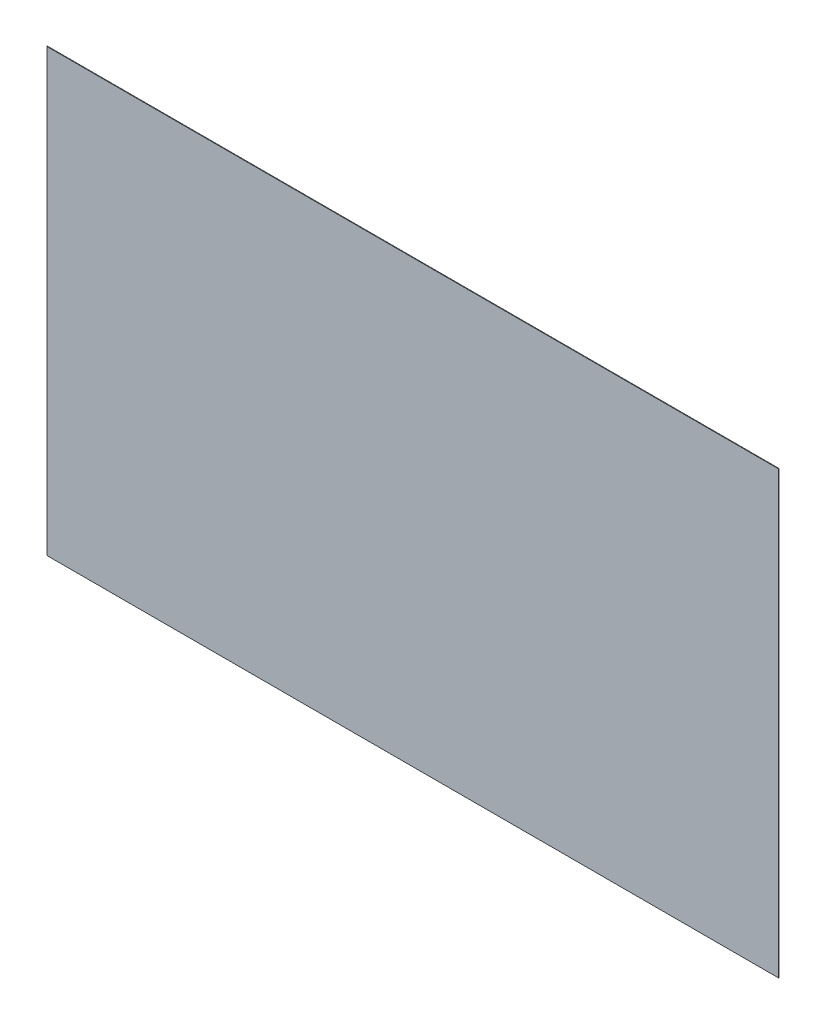
ISO-10303-21;
HEADER;
FILE_DESCRIPTION(('STEP AP214'),'2;1');
FILE_NAME('part.step','',(''),(''),'','','');
FILE_SCHEMA(('AUTOMOTIVE_DESIGN { 1 0 10303 214 1 1 1 1 }'));
ENDSEC;
DATA;
#1=APPLICATION_CONTEXT('core data for automotive mechanical design processes');
#2=APPLICATION_PROTOCOL_DEFINITION('international standard','automotive_design',2000,#1);
#3=PRODUCT_CONTEXT('',#1,'mechanical');
#4=PRODUCT('Part','Part','',(#3));
#5=PRODUCT_RELATED_PRODUCT_CATEGORY('part','',(#4));
#6=PRODUCT_DEFINITION_FORMATION('','',#4);
#7=PRODUCT_DEFINITION_CONTEXT('part definition',#1,'design');
#8=PRODUCT_DEFINITION('design','',#6,#7);
#9=PRODUCT_DEFINITION_SHAPE('','',#8);
#10=(LENGTH_UNIT() NAMED_UNIT(*) SI_UNIT(.MILLI.,.METRE.));
#11=(NAMED_UNIT(*) PLANE_ANGLE_UNIT() SI_UNIT($,.RADIAN.));
#12=(NAMED_UNIT(*) SI_UNIT($,.STERADIAN.) SOLID_ANGLE_UNIT());
#13=UNCERTAINTY_MEASURE_WITH_UNIT(LENGTH_MEASURE(1.E-05),#10,'distance_accuracy_value','');
#14=(GEOMETRIC_REPRESENTATION_CONTEXT(3) GLOBAL_UNCERTAINTY_ASSIGNED_CONTEXT((#13)) GLOBAL_UNIT_ASSIGNED_CONTEXT((#10,
#11,#12)) REPRESENTATION_CONTEXT('',''));
#15=CARTESIAN_POINT('',(0.,0.,0.));
#16=DIRECTION('',(0.,0.,1.));
#17=DIRECTION('',(1.,0.,0.));
#18=AXIS2_PLACEMENT_3D('',#15,#16,#17);
#19=CARTESIAN_POINT('',(2500.,1506.,2.));
#20=DIRECTION('',(0.,-1.,0.));
#21=DIRECTION('',(1.,0.,0.));
#22=AXIS2_PLACEMENT_3D('',#19,#20,#21);
#23=PLANE('',#22);
#24=DIRECTION('',(-1.,0.,0.));
#25=VECTOR('',#24,1.);
#26=CARTESIAN_POINT('',(2500.,1506.,0.));
#27=LINE('',#26,#25);
#28=CARTESIAN_POINT('',(2500.,1506.,0.));
#29=VERTEX_POINT('',#28);
#30=CARTESIAN_POINT('',(-1.70348369761397E-13,1506.,0.));
#31=VERTEX_POINT('',#30);
#32=EDGE_CURVE('E107',#29,#31,#27,.T.);
#33=ORIENTED_EDGE('',*,*,#32,.T.);
#34=DIRECTION('',(0.,0.,-1.));
#35=VECTOR('',#34,1.);
#36=CARTESIAN_POINT('',(-1.70348369761397E-13,1506.,2.));
#37=LINE('',#36,#35);
#38=CARTESIAN_POINT('',(-1.70348369761397E-13,1506.,2.));
#39=VERTEX_POINT('',#38);
#40=EDGE_CURVE('E11',#39,#31,#37,.T.);
#41=ORIENTED_EDGE('',*,*,#40,.F.);
#42=DIRECTION('',(-1.,0.,0.));
#43=VECTOR('',#42,1.);
#44=CARTESIAN_POINT('',(2500.,1506.,2.));
#45=LINE('',#44,#43);
#46=CARTESIAN_POINT('',(2500.,1506.,2.));
#47=VERTEX_POINT('',#46);
#48=EDGE_CURVE('E91',#47,#39,#45,.T.);
#49=ORIENTED_EDGE('',*,*,#48,.F.);
#50=DIRECTION('',(0.,0.,-1.));
#51=VECTOR('',#50,1.);
#52=CARTESIAN_POINT('',(2500.,1506.,2.));
#53=LINE('',#52,#51);
#54=EDGE_CURVE('E103',#47,#29,#53,.T.);
#55=ORIENTED_EDGE('',*,*,#54,.T.);
#56=EDGE_LOOP('',(#33,#41,#49,#55));
#57=FACE_BOUND('',#56,.T.);
#58=ADVANCED_FACE('F39',(#57),#23,.F.);
#59=CARTESIAN_POINT('',(-1.70348369761397E-13,1506.,2.));
#60=DIRECTION('',(1.,0.,0.));
#61=DIRECTION('',(0.,1.,0.));
#62=AXIS2_PLACEMENT_3D('',#59,#60,#61);
#63=PLANE('',#62);
#64=DIRECTION('',(0.,-1.,0.));
#65=VECTOR('',#64,1.);
#66=CARTESIAN_POINT('',(-1.70348369761397E-13,1506.,0.));
#67=LINE('',#66,#65);
#68=CARTESIAN_POINT('',(0.,0.,0.));
#69=VERTEX_POINT('',#68);
#70=EDGE_CURVE('E96',#31,#69,#67,.T.);
#71=ORIENTED_EDGE('',*,*,#70,.T.);
#72=DIRECTION('',(0.,0.,-1.));
#73=VECTOR('',#72,1.);
#74=CARTESIAN_POINT('',(0.,0.,2.));
#75=LINE('',#74,#73);
#76=CARTESIAN_POINT('',(0.,0.,2.));
#77=VERTEX_POINT('',#76);
#78=EDGE_CURVE('E48',#77,#69,#75,.T.);
#79=ORIENTED_EDGE('',*,*,#78,.F.);
#80=DIRECTION('',(0.,-1.,0.));
#81=VECTOR('',#80,1.);
#82=CARTESIAN_POINT('',(-1.70348369761397E-13,1506.,2.));
#83=LINE('',#82,#81);
#84=EDGE_CURVE('E86',#39,#77,#83,.T.);
#85=ORIENTED_EDGE('',*,*,#84,.F.);
#86=ORIENTED_EDGE('',*,*,#40,.T.);
#87=EDGE_LOOP('',(#71,#79,#85,#86));
#88=FACE_BOUND('',#87,.T.);
#89=ADVANCED_FACE('F95',(#88),#63,.F.);
#90=CARTESIAN_POINT('',(2500.,4.59242549680257E-13,2.));
#91=DIRECTION('',(0.,1.,0.));
#92=DIRECTION('',(-1.,0.,0.));
#93=AXIS2_PLACEMENT_3D('',#90,#91,#92);
#94=PLANE('',#93);
#95=DIRECTION('',(1.,0.,0.));
#96=VECTOR('',#95,1.);
#97=CARTESIAN_POINT('',(2500.,4.59242549680257E-13,0.));
#98=LINE('',#97,#96);
#99=CARTESIAN_POINT('',(2500.,4.59242549680257E-13,0.));
#100=VERTEX_POINT('',#99);
#101=EDGE_CURVE('E73',#69,#100,#98,.T.);
#102=ORIENTED_EDGE('',*,*,#101,.T.);
#103=DIRECTION('',(0.,0.,-1.));
#104=VECTOR('',#103,1.);
#105=CARTESIAN_POINT('',(2500.,4.59242549680257E-13,2.));
#106=LINE('',#105,#104);
#107=CARTESIAN_POINT('',(2500.,4.59242549680257E-13,2.));
#108=VERTEX_POINT('',#107);
#109=EDGE_CURVE('E98',#108,#100,#106,.T.);
#110=ORIENTED_EDGE('',*,*,#109,.F.);
#111=DIRECTION('',(1.,0.,0.));
#112=VECTOR('',#111,1.);
#113=CARTESIAN_POINT('',(2500.,4.59242549680257E-13,2.));
#114=LINE('',#113,#112);
#115=EDGE_CURVE('E89',#77,#108,#114,.T.);
#116=ORIENTED_EDGE('',*,*,#115,.F.);
#117=ORIENTED_EDGE('',*,*,#78,.T.);
#118=EDGE_LOOP('',(#102,#110,#116,#117));
#119=FACE_BOUND('',#118,.T.);
#120=ADVANCED_FACE('F99',(#119),#94,.F.);
#121=CARTESIAN_POINT('',(2500.,1506.,2.));
#122=DIRECTION('',(-1.,0.,0.));
#123=DIRECTION('',(0.,0.,1.));
#124=AXIS2_PLACEMENT_3D('',#121,#122,#123);
#125=PLANE('',#124);
#126=DIRECTION('',(0.,1.,0.));
#127=VECTOR('',#126,1.);
#128=CARTESIAN_POINT('',(2500.,1506.,0.));
#129=LINE('',#128,#127);
#130=EDGE_CURVE('E79',#100,#29,#129,.T.);
#131=ORIENTED_EDGE('',*,*,#130,.T.);
#132=ORIENTED_EDGE('',*,*,#54,.F.);
#133=DIRECTION('',(0.,1.,0.));
#134=VECTOR('',#133,1.);
#135=CARTESIAN_POINT('',(2500.,1506.,2.));
#136=LINE('',#135,#134);
#137=EDGE_CURVE('E56',#108,#47,#136,.T.);
#138=ORIENTED_EDGE('',*,*,#137,.F.);
#139=ORIENTED_EDGE('',*,*,#109,.T.);
#140=EDGE_LOOP('',(#131,#132,#138,#139));
#141=FACE_BOUND('',#140,.T.);
#142=ADVANCED_FACE('F120',(#141),#125,.F.);
#143=CARTESIAN_POINT('',(0.,0.,2.));
#144=DIRECTION('',(0.,0.,1.));
#145=DIRECTION('',(1.,0.,0.));
#146=AXIS2_PLACEMENT_3D('',#143,#144,#145);
#147=PLANE('',#146);
#148=ORIENTED_EDGE('',*,*,#48,.T.);
#149=ORIENTED_EDGE('',*,*,#84,.T.);
#150=ORIENTED_EDGE('',*,*,#115,.T.);
#151=ORIENTED_EDGE('',*,*,#137,.T.);
#152=EDGE_LOOP('',(#148,#149,#150,#151));
#153=FACE_BOUND('',#152,.T.);
#154=ADVANCED_FACE('F87',(#153),#147,.T.);
#155=CARTESIAN_POINT('',(0.,0.,0.));
#156=DIRECTION('',(0.,0.,1.));
#157=DIRECTION('',(1.,0.,0.));
#158=AXIS2_PLACEMENT_3D('',#155,#156,#157);
#159=PLANE('',#158);
#160=ORIENTED_EDGE('',*,*,#32,.F.);
#161=ORIENTED_EDGE('',*,*,#130,.F.);
#162=ORIENTED_EDGE('',*,*,#101,.F.);
#163=ORIENTED_EDGE('',*,*,#70,.F.);
#164=EDGE_LOOP('',(#160,#161,#162,#163));
#165=FACE_BOUND('',#164,.T.);
#166=ADVANCED_FACE('F123',(#165),#159,.F.);
#167=CLOSED_SHELL('',(#58,#89,#120,#142,#154,#166));
#168=MANIFOLD_SOLID_BREP('B2',#167);
#169=ADVANCED_BREP_SHAPE_REPRESENTATION('',(#18,#168),#14);
#170=SHAPE_DEFINITION_REPRESENTATION(#9,#169);
ENDSEC;
END-ISO-10303-21;
